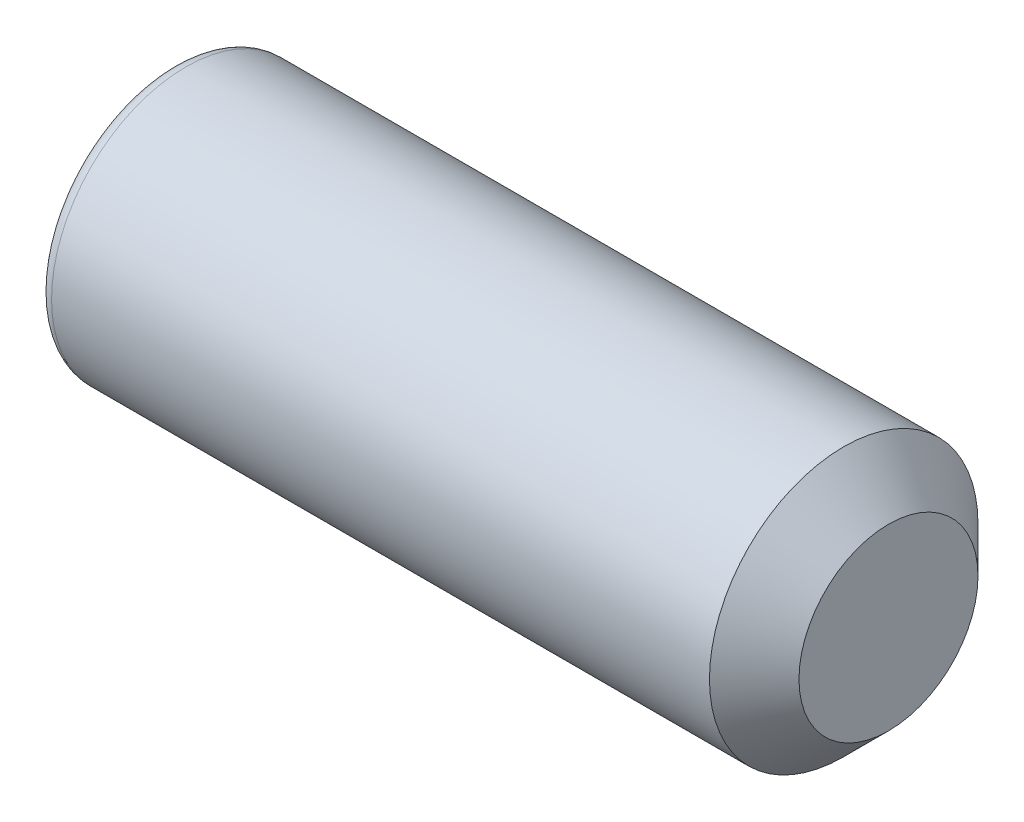
ISO-10303-21;
HEADER;
FILE_DESCRIPTION(('STEP AP214'),'2;1');
FILE_NAME('part.step','',(''),(''),'','','');
FILE_SCHEMA(('AUTOMOTIVE_DESIGN { 1 0 10303 214 1 1 1 1 }'));
ENDSEC;
DATA;
#1=APPLICATION_CONTEXT('core data for automotive mechanical design processes');
#2=APPLICATION_PROTOCOL_DEFINITION('international standard','automotive_design',2000,#1);
#3=PRODUCT_CONTEXT('',#1,'mechanical');
#4=PRODUCT('Part','Part','',(#3));
#5=PRODUCT_RELATED_PRODUCT_CATEGORY('part','',(#4));
#6=PRODUCT_DEFINITION_FORMATION('','',#4);
#7=PRODUCT_DEFINITION_CONTEXT('part definition',#1,'design');
#8=PRODUCT_DEFINITION('design','',#6,#7);
#9=PRODUCT_DEFINITION_SHAPE('','',#8);
#10=(LENGTH_UNIT() NAMED_UNIT(*) SI_UNIT(.MILLI.,.METRE.));
#11=(NAMED_UNIT(*) PLANE_ANGLE_UNIT() SI_UNIT($,.RADIAN.));
#12=(NAMED_UNIT(*) SI_UNIT($,.STERADIAN.) SOLID_ANGLE_UNIT());
#13=UNCERTAINTY_MEASURE_WITH_UNIT(LENGTH_MEASURE(1.E-05),#10,'distance_accuracy_value','');
#14=(GEOMETRIC_REPRESENTATION_CONTEXT(3) GLOBAL_UNCERTAINTY_ASSIGNED_CONTEXT((#13)) GLOBAL_UNIT_ASSIGNED_CONTEXT((#10,
#11,#12)) REPRESENTATION_CONTEXT('',''));
#15=CARTESIAN_POINT('',(0.,0.,0.));
#16=DIRECTION('',(0.,0.,1.));
#17=DIRECTION('',(1.,0.,0.));
#18=AXIS2_PLACEMENT_3D('',#15,#16,#17);
#19=CARTESIAN_POINT('',(0.,0.,0.));
#20=DIRECTION('',(-1.,0.,0.));
#21=DIRECTION('',(0.,0.,1.));
#22=AXIS2_PLACEMENT_3D('',#19,#20,#21);
#23=PLANE('',#22);
#24=CARTESIAN_POINT('',(0.,0.,0.));
#25=DIRECTION('',(-1.,0.,0.));
#26=DIRECTION('',(0.,0.,1.));
#27=AXIS2_PLACEMENT_3D('',#24,#25,#26);
#28=CIRCLE('',#27,1.35);
#29=CARTESIAN_POINT('',(0.,0.,1.35));
#30=VERTEX_POINT('',#29);
#31=EDGE_CURVE('E11',#30,#30,#28,.T.);
#32=ORIENTED_EDGE('',*,*,#31,.T.);
#33=EDGE_LOOP('',(#32));
#34=FACE_BOUND('',#33,.T.);
#35=DIRECTION('',(0.,0.866025403784439,-0.5));
#36=VECTOR('',#35,1.);
#37=CARTESIAN_POINT('',(0.,0.,0.866025403784439));
#38=LINE('',#37,#36);
#39=CARTESIAN_POINT('',(0.,0.,0.866025403784439));
#40=VERTEX_POINT('',#39);
#41=CARTESIAN_POINT('',(0.,0.75,0.433012701892219));
#42=VERTEX_POINT('',#41);
#43=EDGE_CURVE('E49',#40,#42,#38,.T.);
#44=ORIENTED_EDGE('',*,*,#43,.F.);
#45=DIRECTION('',(0.,0.866025403784439,0.5));
#46=VECTOR('',#45,1.);
#47=CARTESIAN_POINT('',(0.,-0.75,0.433012701892219));
#48=LINE('',#47,#46);
#49=CARTESIAN_POINT('',(0.,-0.75,0.433012701892219));
#50=VERTEX_POINT('',#49);
#51=EDGE_CURVE('E132',#50,#40,#48,.T.);
#52=ORIENTED_EDGE('',*,*,#51,.F.);
#53=DIRECTION('',(0.,0.,1.));
#54=VECTOR('',#53,1.);
#55=CARTESIAN_POINT('',(0.,-0.75,-0.433012701892219));
#56=LINE('',#55,#54);
#57=CARTESIAN_POINT('',(0.,-0.75,-0.433012701892219));
#58=VERTEX_POINT('',#57);
#59=EDGE_CURVE('E130',#58,#50,#56,.T.);
#60=ORIENTED_EDGE('',*,*,#59,.F.);
#61=DIRECTION('',(0.,-0.866025403784438,0.5));
#62=VECTOR('',#61,1.);
#63=CARTESIAN_POINT('',(0.,0.,-0.866025403784438));
#64=LINE('',#63,#62);
#65=CARTESIAN_POINT('',(0.,0.,-0.866025403784438));
#66=VERTEX_POINT('',#65);
#67=EDGE_CURVE('E97',#66,#58,#64,.T.);
#68=ORIENTED_EDGE('',*,*,#67,.F.);
#69=DIRECTION('',(0.,-0.866025403784439,-0.5));
#70=VECTOR('',#69,1.);
#71=CARTESIAN_POINT('',(0.,0.75,-0.433012701892219));
#72=LINE('',#71,#70);
#73=CARTESIAN_POINT('',(0.,0.75,-0.433012701892219));
#74=VERTEX_POINT('',#73);
#75=EDGE_CURVE('E126',#74,#66,#72,.T.);
#76=ORIENTED_EDGE('',*,*,#75,.F.);
#77=DIRECTION('',(0.,0.,-1.));
#78=VECTOR('',#77,1.);
#79=CARTESIAN_POINT('',(0.,0.75,0.433012701892219));
#80=LINE('',#79,#78);
#81=EDGE_CURVE('E123',#42,#74,#80,.T.);
#82=ORIENTED_EDGE('',*,*,#81,.F.);
#83=EDGE_LOOP('',(#44,#52,#60,#68,#76,#82));
#84=FACE_BOUND('',#83,.T.);
#85=ADVANCED_FACE('F34',(#34,#84),#23,.T.);
#86=CARTESIAN_POINT('',(8.,0.,0.));
#87=DIRECTION('',(1.,0.,0.));
#88=DIRECTION('',(0.,0.,-1.));
#89=AXIS2_PLACEMENT_3D('',#86,#87,#88);
#90=CYLINDRICAL_SURFACE('',#89,1.5);
#91=CARTESIAN_POINT('',(0.150000000000001,0.,0.));
#92=DIRECTION('',(-1.,0.,0.));
#93=DIRECTION('',(0.,0.,1.));
#94=AXIS2_PLACEMENT_3D('',#91,#92,#93);
#95=CIRCLE('',#94,1.5);
#96=CARTESIAN_POINT('',(0.150000000000001,0.,1.5));
#97=VERTEX_POINT('',#96);
#98=EDGE_CURVE('E42',#97,#97,#95,.F.);
#99=ORIENTED_EDGE('',*,*,#98,.T.);
#100=EDGE_LOOP('',(#99));
#101=FACE_BOUND('',#100,.T.);
#102=CARTESIAN_POINT('',(7.5,0.,0.));
#103=DIRECTION('',(1.,0.,0.));
#104=DIRECTION('',(0.,0.,-1.));
#105=AXIS2_PLACEMENT_3D('',#102,#103,#104);
#106=CIRCLE('',#105,1.5);
#107=CARTESIAN_POINT('',(7.5,0.,-1.5));
#108=VERTEX_POINT('',#107);
#109=EDGE_CURVE('E144',#108,#108,#106,.T.);
#110=ORIENTED_EDGE('',*,*,#109,.F.);
#111=EDGE_LOOP('',(#110));
#112=FACE_BOUND('',#111,.T.);
#113=ADVANCED_FACE('F149',(#101,#112),#90,.T.);
#114=CARTESIAN_POINT('',(8.,0.,0.));
#115=DIRECTION('',(-1.,0.,0.));
#116=DIRECTION('',(0.,0.,1.));
#117=AXIS2_PLACEMENT_3D('',#114,#115,#116);
#118=CONICAL_SURFACE('',#117,1.,0.78539816339745);
#119=ORIENTED_EDGE('',*,*,#109,.T.);
#120=EDGE_LOOP('',(#119));
#121=FACE_BOUND('',#120,.T.);
#122=CARTESIAN_POINT('',(8.,0.,0.));
#123=DIRECTION('',(1.,0.,0.));
#124=DIRECTION('',(0.,0.,-1.));
#125=AXIS2_PLACEMENT_3D('',#122,#123,#124);
#126=CIRCLE('',#125,1.);
#127=CARTESIAN_POINT('',(8.,0.,-1.));
#128=VERTEX_POINT('',#127);
#129=EDGE_CURVE('E136',#128,#128,#126,.T.);
#130=ORIENTED_EDGE('',*,*,#129,.F.);
#131=EDGE_LOOP('',(#130));
#132=FACE_BOUND('',#131,.T.);
#133=ADVANCED_FACE('F165',(#121,#132),#118,.T.);
#134=CARTESIAN_POINT('',(8.,1.,0.));
#135=DIRECTION('',(1.,0.,0.));
#136=DIRECTION('',(0.,0.,-1.));
#137=AXIS2_PLACEMENT_3D('',#134,#135,#136);
#138=PLANE('',#137);
#139=ORIENTED_EDGE('',*,*,#129,.T.);
#140=EDGE_LOOP('',(#139));
#141=FACE_BOUND('',#140,.T.);
#142=ADVANCED_FACE('F171',(#141),#138,.T.);
#143=CARTESIAN_POINT('',(1.2,0.,0.866025403784439));
#144=DIRECTION('',(0.,0.5,0.866025403784439));
#145=DIRECTION('',(0.,-0.866025403784439,0.5));
#146=AXIS2_PLACEMENT_3D('',#143,#144,#145);
#147=PLANE('',#146);
#148=ORIENTED_EDGE('',*,*,#43,.T.);
#149=DIRECTION('',(-1.,0.,0.));
#150=VECTOR('',#149,1.);
#151=CARTESIAN_POINT('',(1.2,0.75,0.433012701892219));
#152=LINE('',#151,#150);
#153=CARTESIAN_POINT('',(1.2,0.75,0.433012701892219));
#154=VERTEX_POINT('',#153);
#155=EDGE_CURVE('E79',#154,#42,#152,.T.);
#156=ORIENTED_EDGE('',*,*,#155,.F.);
#157=DIRECTION('',(0.,0.866025403784439,-0.5));
#158=VECTOR('',#157,1.);
#159=CARTESIAN_POINT('',(1.2,0.,0.866025403784439));
#160=LINE('',#159,#158);
#161=CARTESIAN_POINT('',(1.2,0.,0.866025403784439));
#162=VERTEX_POINT('',#161);
#163=EDGE_CURVE('E134',#162,#154,#160,.T.);
#164=ORIENTED_EDGE('',*,*,#163,.F.);
#165=DIRECTION('',(-1.,0.,0.));
#166=VECTOR('',#165,1.);
#167=CARTESIAN_POINT('',(1.2,0.,0.866025403784439));
#168=LINE('',#167,#166);
#169=EDGE_CURVE('E57',#162,#40,#168,.T.);
#170=ORIENTED_EDGE('',*,*,#169,.T.);
#171=EDGE_LOOP('',(#148,#156,#164,#170));
#172=FACE_BOUND('',#171,.T.);
#173=ADVANCED_FACE('F175',(#172),#147,.F.);
#174=CARTESIAN_POINT('',(1.2,-0.75,0.433012701892219));
#175=DIRECTION('',(0.,-0.5,0.866025403784439));
#176=DIRECTION('',(0.,-0.866025403784439,-0.5));
#177=AXIS2_PLACEMENT_3D('',#174,#175,#176);
#178=PLANE('',#177);
#179=ORIENTED_EDGE('',*,*,#51,.T.);
#180=ORIENTED_EDGE('',*,*,#169,.F.);
#181=DIRECTION('',(0.,0.866025403784439,0.5));
#182=VECTOR('',#181,1.);
#183=CARTESIAN_POINT('',(1.2,-0.75,0.433012701892219));
#184=LINE('',#183,#182);
#185=CARTESIAN_POINT('',(1.2,-0.75,0.433012701892219));
#186=VERTEX_POINT('',#185);
#187=EDGE_CURVE('E109',#186,#162,#184,.T.);
#188=ORIENTED_EDGE('',*,*,#187,.F.);
#189=DIRECTION('',(-1.,0.,0.));
#190=VECTOR('',#189,1.);
#191=CARTESIAN_POINT('',(1.2,-0.75,0.433012701892219));
#192=LINE('',#191,#190);
#193=EDGE_CURVE('E101',#186,#50,#192,.T.);
#194=ORIENTED_EDGE('',*,*,#193,.T.);
#195=EDGE_LOOP('',(#179,#180,#188,#194));
#196=FACE_BOUND('',#195,.T.);
#197=ADVANCED_FACE('F179',(#196),#178,.F.);
#198=CARTESIAN_POINT('',(1.2,-0.75,-0.433012701892219));
#199=DIRECTION('',(0.,-1.,0.));
#200=DIRECTION('',(0.,0.,-1.));
#201=AXIS2_PLACEMENT_3D('',#198,#199,#200);
#202=PLANE('',#201);
#203=ORIENTED_EDGE('',*,*,#59,.T.);
#204=ORIENTED_EDGE('',*,*,#193,.F.);
#205=DIRECTION('',(0.,0.,1.));
#206=VECTOR('',#205,1.);
#207=CARTESIAN_POINT('',(1.2,-0.75,-0.433012701892219));
#208=LINE('',#207,#206);
#209=CARTESIAN_POINT('',(1.2,-0.75,-0.433012701892219));
#210=VERTEX_POINT('',#209);
#211=EDGE_CURVE('E105',#210,#186,#208,.T.);
#212=ORIENTED_EDGE('',*,*,#211,.F.);
#213=DIRECTION('',(-1.,0.,0.));
#214=VECTOR('',#213,1.);
#215=CARTESIAN_POINT('',(1.2,-0.75,-0.433012701892219));
#216=LINE('',#215,#214);
#217=EDGE_CURVE('E90',#210,#58,#216,.T.);
#218=ORIENTED_EDGE('',*,*,#217,.T.);
#219=EDGE_LOOP('',(#203,#204,#212,#218));
#220=FACE_BOUND('',#219,.T.);
#221=ADVANCED_FACE('F106',(#220),#202,.F.);
#222=CARTESIAN_POINT('',(1.2,0.,-0.866025403784438));
#223=DIRECTION('',(0.,-0.5,-0.866025403784439));
#224=DIRECTION('',(0.,0.866025403784439,-0.5));
#225=AXIS2_PLACEMENT_3D('',#222,#223,#224);
#226=PLANE('',#225);
#227=ORIENTED_EDGE('',*,*,#67,.T.);
#228=ORIENTED_EDGE('',*,*,#217,.F.);
#229=DIRECTION('',(0.,-0.866025403784438,0.5));
#230=VECTOR('',#229,1.);
#231=CARTESIAN_POINT('',(1.2,0.,-0.866025403784438));
#232=LINE('',#231,#230);
#233=CARTESIAN_POINT('',(1.2,0.,-0.866025403784438));
#234=VERTEX_POINT('',#233);
#235=EDGE_CURVE('E94',#234,#210,#232,.T.);
#236=ORIENTED_EDGE('',*,*,#235,.F.);
#237=DIRECTION('',(-1.,0.,0.));
#238=VECTOR('',#237,1.);
#239=CARTESIAN_POINT('',(1.2,0.,-0.866025403784438));
#240=LINE('',#239,#238);
#241=EDGE_CURVE('E102',#234,#66,#240,.T.);
#242=ORIENTED_EDGE('',*,*,#241,.T.);
#243=EDGE_LOOP('',(#227,#228,#236,#242));
#244=FACE_BOUND('',#243,.T.);
#245=ADVANCED_FACE('F92',(#244),#226,.F.);
#246=CARTESIAN_POINT('',(1.2,0.75,-0.433012701892219));
#247=DIRECTION('',(0.,0.5,-0.866025403784439));
#248=DIRECTION('',(0.,0.866025403784439,0.5));
#249=AXIS2_PLACEMENT_3D('',#246,#247,#248);
#250=PLANE('',#249);
#251=ORIENTED_EDGE('',*,*,#75,.T.);
#252=ORIENTED_EDGE('',*,*,#241,.F.);
#253=DIRECTION('',(0.,-0.866025403784439,-0.5));
#254=VECTOR('',#253,1.);
#255=CARTESIAN_POINT('',(1.2,0.75,-0.433012701892219));
#256=LINE('',#255,#254);
#257=CARTESIAN_POINT('',(1.2,0.75,-0.433012701892219));
#258=VERTEX_POINT('',#257);
#259=EDGE_CURVE('E115',#258,#234,#256,.T.);
#260=ORIENTED_EDGE('',*,*,#259,.F.);
#261=DIRECTION('',(-1.,0.,0.));
#262=VECTOR('',#261,1.);
#263=CARTESIAN_POINT('',(1.2,0.75,-0.433012701892219));
#264=LINE('',#263,#262);
#265=EDGE_CURVE('E139',#258,#74,#264,.T.);
#266=ORIENTED_EDGE('',*,*,#265,.T.);
#267=EDGE_LOOP('',(#251,#252,#260,#266));
#268=FACE_BOUND('',#267,.T.);
#269=ADVANCED_FACE('F182',(#268),#250,.F.);
#270=CARTESIAN_POINT('',(1.2,0.75,0.433012701892219));
#271=DIRECTION('',(0.,1.,0.));
#272=DIRECTION('',(0.,0.,1.));
#273=AXIS2_PLACEMENT_3D('',#270,#271,#272);
#274=PLANE('',#273);
#275=ORIENTED_EDGE('',*,*,#81,.T.);
#276=ORIENTED_EDGE('',*,*,#265,.F.);
#277=DIRECTION('',(0.,0.,-1.));
#278=VECTOR('',#277,1.);
#279=CARTESIAN_POINT('',(1.2,0.75,0.433012701892219));
#280=LINE('',#279,#278);
#281=EDGE_CURVE('E117',#154,#258,#280,.T.);
#282=ORIENTED_EDGE('',*,*,#281,.F.);
#283=ORIENTED_EDGE('',*,*,#155,.T.);
#284=EDGE_LOOP('',(#275,#276,#282,#283));
#285=FACE_BOUND('',#284,.T.);
#286=ADVANCED_FACE('F157',(#285),#274,.F.);
#287=CARTESIAN_POINT('',(1.2,0.,0.));
#288=DIRECTION('',(-1.,0.,0.));
#289=DIRECTION('',(0.,0.,1.));
#290=AXIS2_PLACEMENT_3D('',#287,#288,#289);
#291=PLANE('',#290);
#292=ORIENTED_EDGE('',*,*,#163,.T.);
#293=ORIENTED_EDGE('',*,*,#281,.T.);
#294=ORIENTED_EDGE('',*,*,#259,.T.);
#295=ORIENTED_EDGE('',*,*,#235,.T.);
#296=ORIENTED_EDGE('',*,*,#211,.T.);
#297=ORIENTED_EDGE('',*,*,#187,.T.);
#298=EDGE_LOOP('',(#292,#293,#294,#295,#296,#297));
#299=FACE_BOUND('',#298,.T.);
#300=ADVANCED_FACE('F112',(#299),#291,.T.);
#301=CARTESIAN_POINT('',(0.150000000000001,0.,0.));
#302=DIRECTION('',(-1.,0.,0.));
#303=DIRECTION('',(0.,0.,1.));
#304=AXIS2_PLACEMENT_3D('',#301,#302,#303);
#305=TOROIDAL_SURFACE('',#304,1.35,0.15);
#306=ORIENTED_EDGE('',*,*,#31,.F.);
#307=EDGE_LOOP('',(#306));
#308=FACE_BOUND('',#307,.T.);
#309=ORIENTED_EDGE('',*,*,#98,.F.);
#310=EDGE_LOOP('',(#309));
#311=FACE_BOUND('',#310,.T.);
#312=ADVANCED_FACE('F36',(#308,#311),#305,.T.);
#313=CLOSED_SHELL('',(#85,#113,#133,#142,#173,#197,#221,#245,#269,#286,#300,#312));
#314=MANIFOLD_SOLID_BREP('B2',#313);
#315=ADVANCED_BREP_SHAPE_REPRESENTATION('',(#18,#314),#14);
#316=SHAPE_DEFINITION_REPRESENTATION(#9,#315);
ENDSEC;
END-ISO-10303-21;
